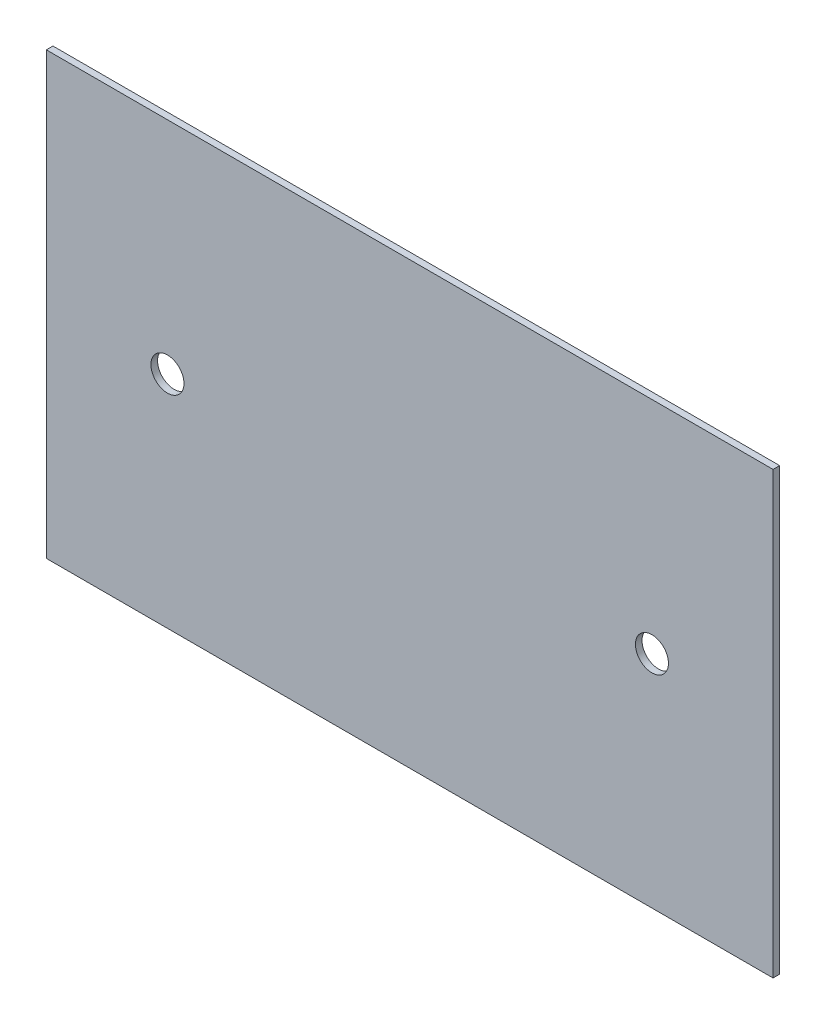
ISO-10303-21;
HEADER;
FILE_DESCRIPTION(('STEP AP214'),'2;1');
FILE_NAME('part.step','',(''),(''),'','','');
FILE_SCHEMA(('AUTOMOTIVE_DESIGN { 1 0 10303 214 1 1 1 1 }'));
ENDSEC;
DATA;
#1=APPLICATION_CONTEXT('core data for automotive mechanical design processes');
#2=APPLICATION_PROTOCOL_DEFINITION('international standard','automotive_design',2000,#1);
#3=PRODUCT_CONTEXT('',#1,'mechanical');
#4=PRODUCT('Part','Part','',(#3));
#5=PRODUCT_RELATED_PRODUCT_CATEGORY('part','',(#4));
#6=PRODUCT_DEFINITION_FORMATION('','',#4);
#7=PRODUCT_DEFINITION_CONTEXT('part definition',#1,'design');
#8=PRODUCT_DEFINITION('design','',#6,#7);
#9=PRODUCT_DEFINITION_SHAPE('','',#8);
#10=(LENGTH_UNIT() NAMED_UNIT(*) SI_UNIT(.MILLI.,.METRE.));
#11=(NAMED_UNIT(*) PLANE_ANGLE_UNIT() SI_UNIT($,.RADIAN.));
#12=(NAMED_UNIT(*) SI_UNIT($,.STERADIAN.) SOLID_ANGLE_UNIT());
#13=UNCERTAINTY_MEASURE_WITH_UNIT(LENGTH_MEASURE(1.E-05),#10,'distance_accuracy_value','');
#14=(GEOMETRIC_REPRESENTATION_CONTEXT(3) GLOBAL_UNCERTAINTY_ASSIGNED_CONTEXT((#13)) GLOBAL_UNIT_ASSIGNED_CONTEXT((#10,
#11,#12)) REPRESENTATION_CONTEXT('',''));
#15=CARTESIAN_POINT('',(0.,0.,0.));
#16=DIRECTION('',(0.,0.,1.));
#17=DIRECTION('',(1.,0.,0.));
#18=AXIS2_PLACEMENT_3D('',#15,#16,#17);
#19=CARTESIAN_POINT('',(165.,100.,3.));
#20=DIRECTION('',(-1.,0.,0.));
#21=DIRECTION('',(0.,-1.,0.));
#22=AXIS2_PLACEMENT_3D('',#19,#20,#21);
#23=PLANE('',#22);
#24=DIRECTION('',(0.,1.,0.));
#25=VECTOR('',#24,1.);
#26=CARTESIAN_POINT('',(165.,100.,0.));
#27=LINE('',#26,#25);
#28=CARTESIAN_POINT('',(165.,-100.,0.));
#29=VERTEX_POINT('',#28);
#30=CARTESIAN_POINT('',(165.,100.,0.));
#31=VERTEX_POINT('',#30);
#32=EDGE_CURVE('E103',#29,#31,#27,.T.);
#33=ORIENTED_EDGE('',*,*,#32,.T.);
#34=DIRECTION('',(0.,0.,-1.));
#35=VECTOR('',#34,1.);
#36=CARTESIAN_POINT('',(165.,100.,3.));
#37=LINE('',#36,#35);
#38=CARTESIAN_POINT('',(165.,100.,3.));
#39=VERTEX_POINT('',#38);
#40=EDGE_CURVE('E11',#39,#31,#37,.T.);
#41=ORIENTED_EDGE('',*,*,#40,.F.);
#42=DIRECTION('',(0.,1.,0.));
#43=VECTOR('',#42,1.);
#44=CARTESIAN_POINT('',(165.,100.,3.));
#45=LINE('',#44,#43);
#46=CARTESIAN_POINT('',(165.,-100.,3.));
#47=VERTEX_POINT('',#46);
#48=EDGE_CURVE('E91',#47,#39,#45,.T.);
#49=ORIENTED_EDGE('',*,*,#48,.F.);
#50=DIRECTION('',(0.,0.,-1.));
#51=VECTOR('',#50,1.);
#52=CARTESIAN_POINT('',(165.,-100.,3.));
#53=LINE('',#52,#51);
#54=EDGE_CURVE('E99',#47,#29,#53,.T.);
#55=ORIENTED_EDGE('',*,*,#54,.T.);
#56=EDGE_LOOP('',(#33,#41,#49,#55));
#57=FACE_BOUND('',#56,.T.);
#58=ADVANCED_FACE('F40',(#57),#23,.F.);
#59=CARTESIAN_POINT('',(-165.,100.,3.));
#60=DIRECTION('',(0.,-1.,0.));
#61=DIRECTION('',(0.,0.,-1.));
#62=AXIS2_PLACEMENT_3D('',#59,#60,#61);
#63=PLANE('',#62);
#64=DIRECTION('',(-1.,0.,0.));
#65=VECTOR('',#64,1.);
#66=CARTESIAN_POINT('',(-165.,100.,0.));
#67=LINE('',#66,#65);
#68=CARTESIAN_POINT('',(-165.,100.,0.));
#69=VERTEX_POINT('',#68);
#70=EDGE_CURVE('E95',#31,#69,#67,.T.);
#71=ORIENTED_EDGE('',*,*,#70,.T.);
#72=DIRECTION('',(0.,0.,-1.));
#73=VECTOR('',#72,1.);
#74=CARTESIAN_POINT('',(-165.,100.,3.));
#75=LINE('',#74,#73);
#76=CARTESIAN_POINT('',(-165.,100.,3.));
#77=VERTEX_POINT('',#76);
#78=EDGE_CURVE('E48',#77,#69,#75,.T.);
#79=ORIENTED_EDGE('',*,*,#78,.F.);
#80=DIRECTION('',(-1.,0.,0.));
#81=VECTOR('',#80,1.);
#82=CARTESIAN_POINT('',(-165.,100.,3.));
#83=LINE('',#82,#81);
#84=EDGE_CURVE('E86',#39,#77,#83,.T.);
#85=ORIENTED_EDGE('',*,*,#84,.F.);
#86=ORIENTED_EDGE('',*,*,#40,.T.);
#87=EDGE_LOOP('',(#71,#79,#85,#86));
#88=FACE_BOUND('',#87,.T.);
#89=ADVANCED_FACE('F94',(#88),#63,.F.);
#90=CARTESIAN_POINT('',(-165.,100.,3.));
#91=DIRECTION('',(1.,0.,0.));
#92=DIRECTION('',(0.,1.,0.));
#93=AXIS2_PLACEMENT_3D('',#90,#91,#92);
#94=PLANE('',#93);
#95=DIRECTION('',(0.,-1.,0.));
#96=VECTOR('',#95,1.);
#97=CARTESIAN_POINT('',(-165.,100.,0.));
#98=LINE('',#97,#96);
#99=CARTESIAN_POINT('',(-165.,-100.,0.));
#100=VERTEX_POINT('',#99);
#101=EDGE_CURVE('E73',#69,#100,#98,.T.);
#102=ORIENTED_EDGE('',*,*,#101,.T.);
#103=DIRECTION('',(0.,0.,-1.));
#104=VECTOR('',#103,1.);
#105=CARTESIAN_POINT('',(-165.,-100.,3.));
#106=LINE('',#105,#104);
#107=CARTESIAN_POINT('',(-165.,-100.,3.));
#108=VERTEX_POINT('',#107);
#109=EDGE_CURVE('E96',#108,#100,#106,.T.);
#110=ORIENTED_EDGE('',*,*,#109,.F.);
#111=DIRECTION('',(0.,-1.,0.));
#112=VECTOR('',#111,1.);
#113=CARTESIAN_POINT('',(-165.,100.,3.));
#114=LINE('',#113,#112);
#115=EDGE_CURVE('E89',#77,#108,#114,.T.);
#116=ORIENTED_EDGE('',*,*,#115,.F.);
#117=ORIENTED_EDGE('',*,*,#78,.T.);
#118=EDGE_LOOP('',(#102,#110,#116,#117));
#119=FACE_BOUND('',#118,.T.);
#120=ADVANCED_FACE('F97',(#119),#94,.F.);
#121=CARTESIAN_POINT('',(-165.,-100.,3.));
#122=DIRECTION('',(0.,1.,0.));
#123=DIRECTION('',(0.,0.,1.));
#124=AXIS2_PLACEMENT_3D('',#121,#122,#123);
#125=PLANE('',#124);
#126=DIRECTION('',(1.,0.,0.));
#127=VECTOR('',#126,1.);
#128=CARTESIAN_POINT('',(-165.,-100.,0.));
#129=LINE('',#128,#127);
#130=EDGE_CURVE('E79',#100,#29,#129,.T.);
#131=ORIENTED_EDGE('',*,*,#130,.T.);
#132=ORIENTED_EDGE('',*,*,#54,.F.);
#133=DIRECTION('',(1.,0.,0.));
#134=VECTOR('',#133,1.);
#135=CARTESIAN_POINT('',(-165.,-100.,3.));
#136=LINE('',#135,#134);
#137=EDGE_CURVE('E56',#108,#47,#136,.T.);
#138=ORIENTED_EDGE('',*,*,#137,.F.);
#139=ORIENTED_EDGE('',*,*,#109,.T.);
#140=EDGE_LOOP('',(#131,#132,#138,#139));
#141=FACE_BOUND('',#140,.T.);
#142=ADVANCED_FACE('F111',(#141),#125,.F.);
#143=CARTESIAN_POINT('',(0.,0.,3.));
#144=DIRECTION('',(0.,0.,1.));
#145=DIRECTION('',(1.,0.,0.));
#146=AXIS2_PLACEMENT_3D('',#143,#144,#145);
#147=PLANE('',#146);
#148=CARTESIAN_POINT('',(-110.,0.,3.));
#149=DIRECTION('',(0.,0.,1.));
#150=DIRECTION('',(1.,0.,0.));
#151=AXIS2_PLACEMENT_3D('',#148,#149,#150);
#152=CIRCLE('',#151,7.50000000000001);
#153=CARTESIAN_POINT('',(-102.5,0.,3.));
#154=VERTEX_POINT('',#153);
#155=EDGE_CURVE('E123',#154,#154,#152,.T.);
#156=ORIENTED_EDGE('',*,*,#155,.F.);
#157=EDGE_LOOP('',(#156));
#158=FACE_BOUND('',#157,.T.);
#159=CARTESIAN_POINT('',(110.,0.,3.));
#160=DIRECTION('',(0.,0.,1.));
#161=DIRECTION('',(-1.,0.,0.));
#162=AXIS2_PLACEMENT_3D('',#159,#160,#161);
#163=CIRCLE('',#162,7.50000000000001);
#164=CARTESIAN_POINT('',(102.5,0.,3.));
#165=VERTEX_POINT('',#164);
#166=EDGE_CURVE('E120',#165,#165,#163,.T.);
#167=ORIENTED_EDGE('',*,*,#166,.F.);
#168=EDGE_LOOP('',(#167));
#169=FACE_BOUND('',#168,.T.);
#170=ORIENTED_EDGE('',*,*,#48,.T.);
#171=ORIENTED_EDGE('',*,*,#84,.T.);
#172=ORIENTED_EDGE('',*,*,#115,.T.);
#173=ORIENTED_EDGE('',*,*,#137,.T.);
#174=EDGE_LOOP('',(#170,#171,#172,#173));
#175=FACE_BOUND('',#174,.T.);
#176=ADVANCED_FACE('F87',(#158,#169,#175),#147,.T.);
#177=CARTESIAN_POINT('',(0.,0.,0.));
#178=DIRECTION('',(0.,0.,1.));
#179=DIRECTION('',(1.,0.,0.));
#180=AXIS2_PLACEMENT_3D('',#177,#178,#179);
#181=PLANE('',#180);
#182=CARTESIAN_POINT('',(-110.,0.,0.));
#183=DIRECTION('',(0.,0.,1.));
#184=DIRECTION('',(1.,0.,0.));
#185=AXIS2_PLACEMENT_3D('',#182,#183,#184);
#186=CIRCLE('',#185,7.50000000000001);
#187=CARTESIAN_POINT('',(-102.5,0.,0.));
#188=VERTEX_POINT('',#187);
#189=EDGE_CURVE('E106',#188,#188,#186,.T.);
#190=ORIENTED_EDGE('',*,*,#189,.T.);
#191=EDGE_LOOP('',(#190));
#192=FACE_BOUND('',#191,.T.);
#193=CARTESIAN_POINT('',(110.,0.,0.));
#194=DIRECTION('',(0.,0.,1.));
#195=DIRECTION('',(-1.,0.,0.));
#196=AXIS2_PLACEMENT_3D('',#193,#194,#195);
#197=CIRCLE('',#196,7.50000000000001);
#198=CARTESIAN_POINT('',(102.5,0.,0.));
#199=VERTEX_POINT('',#198);
#200=EDGE_CURVE('E117',#199,#199,#197,.T.);
#201=ORIENTED_EDGE('',*,*,#200,.T.);
#202=EDGE_LOOP('',(#201));
#203=FACE_BOUND('',#202,.T.);
#204=ORIENTED_EDGE('',*,*,#32,.F.);
#205=ORIENTED_EDGE('',*,*,#130,.F.);
#206=ORIENTED_EDGE('',*,*,#101,.F.);
#207=ORIENTED_EDGE('',*,*,#70,.F.);
#208=EDGE_LOOP('',(#204,#205,#206,#207));
#209=FACE_BOUND('',#208,.T.);
#210=ADVANCED_FACE('F114',(#192,#203,#209),#181,.F.);
#211=CARTESIAN_POINT('',(110.,0.,0.));
#212=DIRECTION('',(0.,0.,1.));
#213=DIRECTION('',(1.,0.,0.));
#214=AXIS2_PLACEMENT_3D('',#211,#212,#213);
#215=CYLINDRICAL_SURFACE('',#214,7.50000000000001);
#216=ORIENTED_EDGE('',*,*,#200,.F.);
#217=EDGE_LOOP('',(#216));
#218=FACE_BOUND('',#217,.T.);
#219=ORIENTED_EDGE('',*,*,#166,.T.);
#220=EDGE_LOOP('',(#219));
#221=FACE_BOUND('',#220,.T.);
#222=ADVANCED_FACE('F134',(#218,#221),#215,.F.);
#223=CARTESIAN_POINT('',(-110.,0.,0.));
#224=DIRECTION('',(0.,0.,1.));
#225=DIRECTION('',(1.,0.,0.));
#226=AXIS2_PLACEMENT_3D('',#223,#224,#225);
#227=CYLINDRICAL_SURFACE('',#226,7.50000000000001);
#228=ORIENTED_EDGE('',*,*,#189,.F.);
#229=EDGE_LOOP('',(#228));
#230=FACE_BOUND('',#229,.T.);
#231=ORIENTED_EDGE('',*,*,#155,.T.);
#232=EDGE_LOOP('',(#231));
#233=FACE_BOUND('',#232,.T.);
#234=ADVANCED_FACE('F131',(#230,#233),#227,.F.);
#235=CLOSED_SHELL('',(#58,#89,#120,#142,#176,#210,#222,#234));
#236=MANIFOLD_SOLID_BREP('B2',#235);
#237=ADVANCED_BREP_SHAPE_REPRESENTATION('',(#18,#236),#14);
#238=SHAPE_DEFINITION_REPRESENTATION(#9,#237);
ENDSEC;
END-ISO-10303-21;
